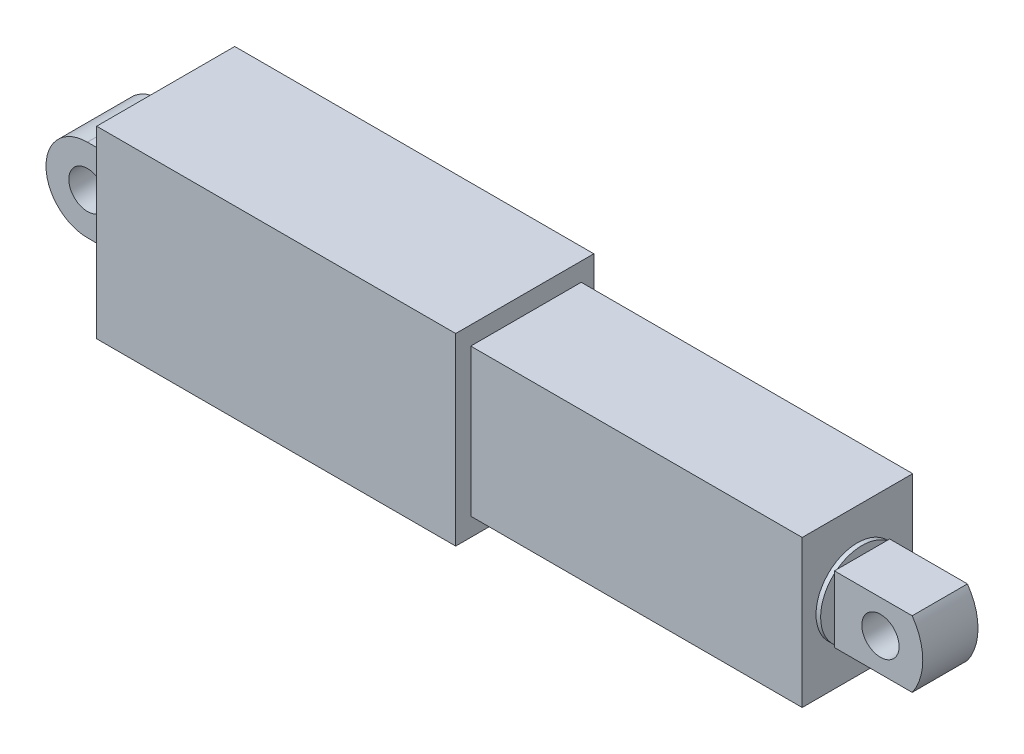
ISO-10303-21;
HEADER;
FILE_DESCRIPTION(('STEP AP214'),'2;1');
FILE_NAME('part.step','',(''),(''),'','','');
FILE_SCHEMA(('AUTOMOTIVE_DESIGN { 1 0 10303 214 1 1 1 1 }'));
ENDSEC;
DATA;
#1=APPLICATION_CONTEXT('core data for automotive mechanical design processes');
#2=APPLICATION_PROTOCOL_DEFINITION('international standard','automotive_design',2000,#1);
#3=PRODUCT_CONTEXT('',#1,'mechanical');
#4=PRODUCT('Part','Part','',(#3));
#5=PRODUCT_RELATED_PRODUCT_CATEGORY('part','',(#4));
#6=PRODUCT_DEFINITION_FORMATION('','',#4);
#7=PRODUCT_DEFINITION_CONTEXT('part definition',#1,'design');
#8=PRODUCT_DEFINITION('design','',#6,#7);
#9=PRODUCT_DEFINITION_SHAPE('','',#8);
#10=(LENGTH_UNIT() NAMED_UNIT(*) SI_UNIT(.MILLI.,.METRE.));
#11=(NAMED_UNIT(*) PLANE_ANGLE_UNIT() SI_UNIT($,.RADIAN.));
#12=(NAMED_UNIT(*) SI_UNIT($,.STERADIAN.) SOLID_ANGLE_UNIT());
#13=UNCERTAINTY_MEASURE_WITH_UNIT(LENGTH_MEASURE(1.E-05),#10,'distance_accuracy_value','');
#14=(GEOMETRIC_REPRESENTATION_CONTEXT(3) GLOBAL_UNCERTAINTY_ASSIGNED_CONTEXT((#13)) GLOBAL_UNIT_ASSIGNED_CONTEXT((#10,
#11,#12)) REPRESENTATION_CONTEXT('',''));
#15=CARTESIAN_POINT('',(0.,0.,0.));
#16=DIRECTION('',(0.,0.,1.));
#17=DIRECTION('',(1.,0.,0.));
#18=AXIS2_PLACEMENT_3D('',#15,#16,#17);
#19=CARTESIAN_POINT('',(56.,0.,7.36600378283812));
#20=DIRECTION('',(1.,0.,0.));
#21=DIRECTION('',(0.,0.,-1.));
#22=AXIS2_PLACEMENT_3D('',#19,#20,#21);
#23=PLANE('',#22);
#24=CARTESIAN_POINT('',(56.,0.,7.36600378283812));
#25=DIRECTION('',(1.,0.,0.));
#26=DIRECTION('',(0.,0.,-1.));
#27=AXIS2_PLACEMENT_3D('',#24,#25,#26);
#28=CIRCLE('',#27,4.5);
#29=CARTESIAN_POINT('',(56.,-3.60478363427384,10.0596138047365));
#30=VERTEX_POINT('',#29);
#31=CARTESIAN_POINT('',(56.,-3.60478363427384,4.67239376093972));
#32=VERTEX_POINT('',#31);
#33=EDGE_CURVE('E514',#30,#32,#28,.T.);
#34=ORIENTED_EDGE('',*,*,#33,.T.);
#35=DIRECTION('',(0.,0.,1.));
#36=VECTOR('',#35,1.);
#37=CARTESIAN_POINT('',(56.,-3.60478363427384,4.36600378283812));
#38=LINE('',#37,#36);
#39=EDGE_CURVE('E11',#32,#30,#38,.T.);
#40=ORIENTED_EDGE('',*,*,#39,.T.);
#41=EDGE_LOOP('',(#34,#40));
#42=FACE_BOUND('',#41,.T.);
#43=ADVANCED_FACE('F45',(#42),#23,.T.);
#44=DIRECTION('',(0.,-1.,0.));
#45=VECTOR('',#44,1.);
#46=CARTESIAN_POINT('',(56.,-3.60478363427384,10.3660037828381));
#47=LINE('',#46,#45);
#48=CARTESIAN_POINT('',(56.,3.35410196624968,10.3660037828381));
#49=VERTEX_POINT('',#48);
#50=CARTESIAN_POINT('',(56.,-3.35410196624968,10.3660037828381));
#51=VERTEX_POINT('',#50);
#52=EDGE_CURVE('E55',#49,#51,#47,.T.);
#53=ORIENTED_EDGE('',*,*,#52,.F.);
#54=EDGE_CURVE('E509',#49,#51,#28,.T.);
#55=ORIENTED_EDGE('',*,*,#54,.T.);
#56=EDGE_LOOP('',(#53,#55));
#57=FACE_BOUND('',#56,.T.);
#58=ADVANCED_FACE('F448',(#57),#23,.T.);
#59=CARTESIAN_POINT('',(56.,-3.35410196624968,4.36600378283812));
#60=VERTEX_POINT('',#59);
#61=CARTESIAN_POINT('',(56.,3.35410196624968,4.36600378283812));
#62=VERTEX_POINT('',#61);
#63=EDGE_CURVE('E253',#60,#62,#28,.T.);
#64=ORIENTED_EDGE('',*,*,#63,.T.);
#65=DIRECTION('',(0.,-1.,0.));
#66=VECTOR('',#65,1.);
#67=CARTESIAN_POINT('',(56.,-3.60478363427384,4.36600378283812));
#68=LINE('',#67,#66);
#69=EDGE_CURVE('E239',#62,#60,#68,.T.);
#70=ORIENTED_EDGE('',*,*,#69,.T.);
#71=EDGE_LOOP('',(#64,#70));
#72=FACE_BOUND('',#71,.T.);
#73=ADVANCED_FACE('F456',(#72),#23,.T.);
#74=CARTESIAN_POINT('',(19.5,10.,15.));
#75=DIRECTION('',(-1.,0.,0.));
#76=DIRECTION('',(0.,-1.,0.));
#77=AXIS2_PLACEMENT_3D('',#74,#75,#76);
#78=PLANE('',#77);
#79=DIRECTION('',(0.,1.,0.));
#80=VECTOR('',#79,1.);
#81=CARTESIAN_POINT('',(19.5,10.,0.));
#82=LINE('',#81,#80);
#83=CARTESIAN_POINT('',(19.5,-10.,0.));
#84=VERTEX_POINT('',#83);
#85=CARTESIAN_POINT('',(19.5,10.,0.));
#86=VERTEX_POINT('',#85);
#87=EDGE_CURVE('E347',#84,#86,#82,.T.);
#88=ORIENTED_EDGE('',*,*,#87,.T.);
#89=DIRECTION('',(0.,0.,-1.));
#90=VECTOR('',#89,1.);
#91=CARTESIAN_POINT('',(19.5,10.,15.));
#92=LINE('',#91,#90);
#93=CARTESIAN_POINT('',(19.5,10.,15.));
#94=VERTEX_POINT('',#93);
#95=EDGE_CURVE('E385',#94,#86,#92,.T.);
#96=ORIENTED_EDGE('',*,*,#95,.F.);
#97=DIRECTION('',(0.,1.,0.));
#98=VECTOR('',#97,1.);
#99=CARTESIAN_POINT('',(19.5,10.,15.));
#100=LINE('',#99,#98);
#101=CARTESIAN_POINT('',(19.5,-10.,15.));
#102=VERTEX_POINT('',#101);
#103=EDGE_CURVE('E348',#102,#94,#100,.T.);
#104=ORIENTED_EDGE('',*,*,#103,.F.);
#105=DIRECTION('',(0.,0.,-1.));
#106=VECTOR('',#105,1.);
#107=CARTESIAN_POINT('',(19.5,-10.,15.));
#108=LINE('',#107,#106);
#109=EDGE_CURVE('E362',#102,#84,#108,.T.);
#110=ORIENTED_EDGE('',*,*,#109,.T.);
#111=EDGE_LOOP('',(#88,#96,#104,#110));
#112=FACE_BOUND('',#111,.T.);
#113=DIRECTION('',(0.,1.,0.));
#114=VECTOR('',#113,1.);
#115=CARTESIAN_POINT('',(19.5,8.,1.36600378283813));
#116=LINE('',#115,#114);
#117=CARTESIAN_POINT('',(19.5,-8.,1.36600378283812));
#118=VERTEX_POINT('',#117);
#119=CARTESIAN_POINT('',(19.5,8.,1.36600378283813));
#120=VERTEX_POINT('',#119);
#121=EDGE_CURVE('E73',#118,#120,#116,.T.);
#122=ORIENTED_EDGE('',*,*,#121,.F.);
#123=DIRECTION('',(0.,0.,-1.));
#124=VECTOR('',#123,1.);
#125=CARTESIAN_POINT('',(19.5,-8.,13.3660037828381));
#126=LINE('',#125,#124);
#127=CARTESIAN_POINT('',(19.5,-8.,13.3660037828381));
#128=VERTEX_POINT('',#127);
#129=EDGE_CURVE('E277',#128,#118,#126,.T.);
#130=ORIENTED_EDGE('',*,*,#129,.F.);
#131=DIRECTION('',(0.,-1.,0.));
#132=VECTOR('',#131,1.);
#133=CARTESIAN_POINT('',(19.5,8.,13.3660037828381));
#134=LINE('',#133,#132);
#135=CARTESIAN_POINT('',(19.5,8.,13.3660037828381));
#136=VERTEX_POINT('',#135);
#137=EDGE_CURVE('E293',#136,#128,#134,.T.);
#138=ORIENTED_EDGE('',*,*,#137,.F.);
#139=DIRECTION('',(0.,0.,1.));
#140=VECTOR('',#139,1.);
#141=CARTESIAN_POINT('',(19.5,8.,13.3660037828381));
#142=LINE('',#141,#140);
#143=EDGE_CURVE('E289',#120,#136,#142,.T.);
#144=ORIENTED_EDGE('',*,*,#143,.F.);
#145=EDGE_LOOP('',(#122,#130,#138,#144));
#146=FACE_BOUND('',#145,.T.);
#147=ADVANCED_FACE('F476',(#112,#146),#78,.F.);
#148=CARTESIAN_POINT('',(-19.5,10.,15.));
#149=DIRECTION('',(1.,0.,0.));
#150=DIRECTION('',(0.,0.,-1.));
#151=AXIS2_PLACEMENT_3D('',#148,#149,#150);
#152=PLANE('',#151);
#153=DIRECTION('',(0.,-1.,0.));
#154=VECTOR('',#153,1.);
#155=CARTESIAN_POINT('',(-19.5,10.,0.));
#156=LINE('',#155,#154);
#157=CARTESIAN_POINT('',(-19.5,10.,0.));
#158=VERTEX_POINT('',#157);
#159=CARTESIAN_POINT('',(-19.5,-10.,0.));
#160=VERTEX_POINT('',#159);
#161=EDGE_CURVE('E369',#158,#160,#156,.T.);
#162=ORIENTED_EDGE('',*,*,#161,.T.);
#163=DIRECTION('',(0.,0.,-1.));
#164=VECTOR('',#163,1.);
#165=CARTESIAN_POINT('',(-19.5,-10.,15.));
#166=LINE('',#165,#164);
#167=CARTESIAN_POINT('',(-19.5,-10.,15.));
#168=VERTEX_POINT('',#167);
#169=EDGE_CURVE('E377',#168,#160,#166,.T.);
#170=ORIENTED_EDGE('',*,*,#169,.F.);
#171=DIRECTION('',(0.,-1.,0.));
#172=VECTOR('',#171,1.);
#173=CARTESIAN_POINT('',(-19.5,10.,15.));
#174=LINE('',#173,#172);
#175=CARTESIAN_POINT('',(-19.5,10.,15.));
#176=VERTEX_POINT('',#175);
#177=EDGE_CURVE('E356',#176,#168,#174,.T.);
#178=ORIENTED_EDGE('',*,*,#177,.F.);
#179=DIRECTION('',(0.,0.,-1.));
#180=VECTOR('',#179,1.);
#181=CARTESIAN_POINT('',(-19.5,10.,15.));
#182=LINE('',#181,#180);
#183=EDGE_CURVE('E381',#176,#158,#182,.T.);
#184=ORIENTED_EDGE('',*,*,#183,.T.);
#185=EDGE_LOOP('',(#162,#170,#178,#184));
#186=FACE_BOUND('',#185,.T.);
#187=DIRECTION('',(0.,1.,0.));
#188=VECTOR('',#187,1.);
#189=CARTESIAN_POINT('',(-19.5,4.5,11.5));
#190=LINE('',#189,#188);
#191=CARTESIAN_POINT('',(-19.5,-4.5,11.5));
#192=VERTEX_POINT('',#191);
#193=CARTESIAN_POINT('',(-19.5,4.5,11.5));
#194=VERTEX_POINT('',#193);
#195=EDGE_CURVE('E319',#192,#194,#190,.T.);
#196=ORIENTED_EDGE('',*,*,#195,.F.);
#197=DIRECTION('',(0.,0.,1.));
#198=VECTOR('',#197,1.);
#199=CARTESIAN_POINT('',(-19.5,-4.5,3.5));
#200=LINE('',#199,#198);
#201=CARTESIAN_POINT('',(-19.5,-4.5,3.5));
#202=VERTEX_POINT('',#201);
#203=EDGE_CURVE('E331',#202,#192,#200,.T.);
#204=ORIENTED_EDGE('',*,*,#203,.F.);
#205=DIRECTION('',(0.,-1.,0.));
#206=VECTOR('',#205,1.);
#207=CARTESIAN_POINT('',(-19.5,4.5,3.5));
#208=LINE('',#207,#206);
#209=CARTESIAN_POINT('',(-19.5,4.5,3.5));
#210=VERTEX_POINT('',#209);
#211=EDGE_CURVE('E327',#210,#202,#208,.T.);
#212=ORIENTED_EDGE('',*,*,#211,.F.);
#213=DIRECTION('',(0.,0.,-1.));
#214=VECTOR('',#213,1.);
#215=CARTESIAN_POINT('',(-19.5,4.5,3.5));
#216=LINE('',#215,#214);
#217=EDGE_CURVE('E323',#194,#210,#216,.T.);
#218=ORIENTED_EDGE('',*,*,#217,.F.);
#219=EDGE_LOOP('',(#196,#204,#212,#218));
#220=FACE_BOUND('',#219,.T.);
#221=ADVANCED_FACE('F434',(#186,#220),#152,.F.);
#222=CARTESIAN_POINT('',(-19.5,10.,15.));
#223=DIRECTION('',(0.,-1.,0.));
#224=DIRECTION('',(0.,0.,-1.));
#225=AXIS2_PLACEMENT_3D('',#222,#223,#224);
#226=PLANE('',#225);
#227=DIRECTION('',(-1.,0.,0.));
#228=VECTOR('',#227,1.);
#229=CARTESIAN_POINT('',(-19.5,10.,0.));
#230=LINE('',#229,#228);
#231=EDGE_CURVE('E366',#86,#158,#230,.T.);
#232=ORIENTED_EDGE('',*,*,#231,.T.);
#233=ORIENTED_EDGE('',*,*,#183,.F.);
#234=DIRECTION('',(-1.,0.,0.));
#235=VECTOR('',#234,1.);
#236=CARTESIAN_POINT('',(-19.5,10.,15.));
#237=LINE('',#236,#235);
#238=EDGE_CURVE('E352',#94,#176,#237,.T.);
#239=ORIENTED_EDGE('',*,*,#238,.F.);
#240=ORIENTED_EDGE('',*,*,#95,.T.);
#241=EDGE_LOOP('',(#232,#233,#239,#240));
#242=FACE_BOUND('',#241,.T.);
#243=ADVANCED_FACE('F696',(#242),#226,.F.);
#244=CARTESIAN_POINT('',(-19.5,-10.,15.));
#245=DIRECTION('',(0.,1.,0.));
#246=DIRECTION('',(0.,0.,1.));
#247=AXIS2_PLACEMENT_3D('',#244,#245,#246);
#248=PLANE('',#247);
#249=DIRECTION('',(1.,0.,0.));
#250=VECTOR('',#249,1.);
#251=CARTESIAN_POINT('',(-19.5,-10.,0.));
#252=LINE('',#251,#250);
#253=EDGE_CURVE('E353',#160,#84,#252,.T.);
#254=ORIENTED_EDGE('',*,*,#253,.T.);
#255=ORIENTED_EDGE('',*,*,#109,.F.);
#256=DIRECTION('',(1.,0.,0.));
#257=VECTOR('',#256,1.);
#258=CARTESIAN_POINT('',(-19.5,-10.,15.));
#259=LINE('',#258,#257);
#260=EDGE_CURVE('E359',#168,#102,#259,.T.);
#261=ORIENTED_EDGE('',*,*,#260,.F.);
#262=ORIENTED_EDGE('',*,*,#169,.T.);
#263=EDGE_LOOP('',(#254,#255,#261,#262));
#264=FACE_BOUND('',#263,.T.);
#265=ADVANCED_FACE('F716',(#264),#248,.F.);
#266=CARTESIAN_POINT('',(0.,0.,15.));
#267=DIRECTION('',(0.,0.,1.));
#268=DIRECTION('',(1.,0.,0.));
#269=AXIS2_PLACEMENT_3D('',#266,#267,#268);
#270=PLANE('',#269);
#271=ORIENTED_EDGE('',*,*,#103,.T.);
#272=ORIENTED_EDGE('',*,*,#238,.T.);
#273=ORIENTED_EDGE('',*,*,#177,.T.);
#274=ORIENTED_EDGE('',*,*,#260,.T.);
#275=EDGE_LOOP('',(#271,#272,#273,#274));
#276=FACE_BOUND('',#275,.T.);
#277=ADVANCED_FACE('F706',(#276),#270,.T.);
#278=CARTESIAN_POINT('',(0.,0.,0.));
#279=DIRECTION('',(0.,0.,1.));
#280=DIRECTION('',(1.,0.,0.));
#281=AXIS2_PLACEMENT_3D('',#278,#279,#280);
#282=PLANE('',#281);
#283=ORIENTED_EDGE('',*,*,#87,.F.);
#284=ORIENTED_EDGE('',*,*,#253,.F.);
#285=ORIENTED_EDGE('',*,*,#161,.F.);
#286=ORIENTED_EDGE('',*,*,#231,.F.);
#287=EDGE_LOOP('',(#283,#284,#285,#286));
#288=FACE_BOUND('',#287,.T.);
#289=ADVANCED_FACE('F676',(#288),#282,.F.);
#290=CARTESIAN_POINT('',(-28.5,4.5,11.5));
#291=DIRECTION('',(0.,0.,-1.));
#292=DIRECTION('',(0.,1.,0.));
#293=AXIS2_PLACEMENT_3D('',#290,#291,#292);
#294=PLANE('',#293);
#295=CARTESIAN_POINT('',(-24.,0.,11.5));
#296=DIRECTION('',(0.,0.,1.));
#297=DIRECTION('',(1.,0.,0.));
#298=AXIS2_PLACEMENT_3D('',#295,#296,#297);
#299=CIRCLE('',#298,2.025);
#300=CARTESIAN_POINT('',(-21.975,0.,11.5));
#301=VERTEX_POINT('',#300);
#302=EDGE_CURVE('E314',#301,#301,#299,.T.);
#303=ORIENTED_EDGE('',*,*,#302,.F.);
#304=EDGE_LOOP('',(#303));
#305=FACE_BOUND('',#304,.T.);
#306=CARTESIAN_POINT('',(-24.,0.,11.5));
#307=DIRECTION('',(0.,0.,-1.));
#308=DIRECTION('',(0.,1.,0.));
#309=AXIS2_PLACEMENT_3D('',#306,#307,#308);
#310=CIRCLE('',#309,4.5);
#311=CARTESIAN_POINT('',(-24.,4.5,11.5));
#312=VERTEX_POINT('',#311);
#313=CARTESIAN_POINT('',(-28.5,0.,11.5));
#314=VERTEX_POINT('',#313);
#315=EDGE_CURVE('E389',#312,#314,#310,.F.);
#316=ORIENTED_EDGE('',*,*,#315,.T.);
#317=CARTESIAN_POINT('',(-24.,0.,11.5));
#318=DIRECTION('',(0.,0.,-1.));
#319=DIRECTION('',(0.,1.,0.));
#320=AXIS2_PLACEMENT_3D('',#317,#318,#319);
#321=CIRCLE('',#320,4.5);
#322=CARTESIAN_POINT('',(-24.,-4.5,11.5));
#323=VERTEX_POINT('',#322);
#324=EDGE_CURVE('E395',#314,#323,#321,.F.);
#325=ORIENTED_EDGE('',*,*,#324,.T.);
#326=DIRECTION('',(1.,0.,0.));
#327=VECTOR('',#326,1.);
#328=CARTESIAN_POINT('',(-28.5,-4.5,11.5));
#329=LINE('',#328,#327);
#330=EDGE_CURVE('E335',#323,#192,#329,.T.);
#331=ORIENTED_EDGE('',*,*,#330,.T.);
#332=ORIENTED_EDGE('',*,*,#195,.T.);
#333=DIRECTION('',(1.,0.,0.));
#334=VECTOR('',#333,1.);
#335=CARTESIAN_POINT('',(-28.5,4.5,11.5));
#336=LINE('',#335,#334);
#337=EDGE_CURVE('E344',#312,#194,#336,.T.);
#338=ORIENTED_EDGE('',*,*,#337,.F.);
#339=EDGE_LOOP('',(#316,#325,#331,#332,#338));
#340=FACE_BOUND('',#339,.T.);
#341=ADVANCED_FACE('F418',(#305,#340),#294,.F.);
#342=CARTESIAN_POINT('',(-28.5,4.5,3.5));
#343=DIRECTION('',(0.,-1.,0.));
#344=DIRECTION('',(0.,0.,-1.));
#345=AXIS2_PLACEMENT_3D('',#342,#343,#344);
#346=PLANE('',#345);
#347=DIRECTION('',(1.,0.,0.));
#348=VECTOR('',#347,1.);
#349=CARTESIAN_POINT('',(-28.5,4.5,3.5));
#350=LINE('',#349,#348);
#351=CARTESIAN_POINT('',(-24.,4.5,3.5));
#352=VERTEX_POINT('',#351);
#353=EDGE_CURVE('E341',#352,#210,#350,.T.);
#354=ORIENTED_EDGE('',*,*,#353,.F.);
#355=DIRECTION('',(0.,0.,-1.));
#356=VECTOR('',#355,1.);
#357=CARTESIAN_POINT('',(-24.,4.5,11.5));
#358=LINE('',#357,#356);
#359=EDGE_CURVE('E271',#352,#312,#358,.F.);
#360=ORIENTED_EDGE('',*,*,#359,.T.);
#361=ORIENTED_EDGE('',*,*,#337,.T.);
#362=ORIENTED_EDGE('',*,*,#217,.T.);
#363=EDGE_LOOP('',(#354,#360,#361,#362));
#364=FACE_BOUND('',#363,.T.);
#365=ADVANCED_FACE('F412',(#364),#346,.F.);
#366=CARTESIAN_POINT('',(-28.5,4.5,3.5));
#367=DIRECTION('',(0.,0.,1.));
#368=DIRECTION('',(0.,-1.,0.));
#369=AXIS2_PLACEMENT_3D('',#366,#367,#368);
#370=PLANE('',#369);
#371=CARTESIAN_POINT('',(-24.,0.,3.5));
#372=DIRECTION('',(0.,0.,1.));
#373=DIRECTION('',(0.,-1.,0.));
#374=AXIS2_PLACEMENT_3D('',#371,#372,#373);
#375=CIRCLE('',#374,2.025);
#376=CARTESIAN_POINT('',(-24.,-2.025,3.5));
#377=VERTEX_POINT('',#376);
#378=EDGE_CURVE('E318',#377,#377,#375,.T.);
#379=ORIENTED_EDGE('',*,*,#378,.T.);
#380=EDGE_LOOP('',(#379));
#381=FACE_BOUND('',#380,.T.);
#382=DIRECTION('',(1.,0.,0.));
#383=VECTOR('',#382,1.);
#384=CARTESIAN_POINT('',(-28.5,-4.5,3.5));
#385=LINE('',#384,#383);
#386=CARTESIAN_POINT('',(-24.,-4.5,3.5));
#387=VERTEX_POINT('',#386);
#388=EDGE_CURVE('E338',#387,#202,#385,.T.);
#389=ORIENTED_EDGE('',*,*,#388,.F.);
#390=CARTESIAN_POINT('',(-24.,0.,3.5));
#391=DIRECTION('',(0.,0.,1.));
#392=DIRECTION('',(0.,-1.,0.));
#393=AXIS2_PLACEMENT_3D('',#390,#391,#392);
#394=CIRCLE('',#393,4.5);
#395=CARTESIAN_POINT('',(-28.5,0.,3.5));
#396=VERTEX_POINT('',#395);
#397=EDGE_CURVE('E405',#387,#396,#394,.F.);
#398=ORIENTED_EDGE('',*,*,#397,.T.);
#399=CARTESIAN_POINT('',(-24.,0.,3.5));
#400=DIRECTION('',(0.,0.,1.));
#401=DIRECTION('',(0.,-1.,0.));
#402=AXIS2_PLACEMENT_3D('',#399,#400,#401);
#403=CIRCLE('',#402,4.5);
#404=EDGE_CURVE('E402',#396,#352,#403,.F.);
#405=ORIENTED_EDGE('',*,*,#404,.T.);
#406=ORIENTED_EDGE('',*,*,#353,.T.);
#407=ORIENTED_EDGE('',*,*,#211,.T.);
#408=EDGE_LOOP('',(#389,#398,#405,#406,#407));
#409=FACE_BOUND('',#408,.T.);
#410=ADVANCED_FACE('F436',(#381,#409),#370,.F.);
#411=CARTESIAN_POINT('',(-28.5,-4.5,3.5));
#412=DIRECTION('',(0.,1.,0.));
#413=DIRECTION('',(0.,0.,1.));
#414=AXIS2_PLACEMENT_3D('',#411,#412,#413);
#415=PLANE('',#414);
#416=ORIENTED_EDGE('',*,*,#330,.F.);
#417=DIRECTION('',(0.,0.,1.));
#418=VECTOR('',#417,1.);
#419=CARTESIAN_POINT('',(-24.,-4.5,3.5));
#420=LINE('',#419,#418);
#421=EDGE_CURVE('E398',#323,#387,#420,.F.);
#422=ORIENTED_EDGE('',*,*,#421,.T.);
#423=ORIENTED_EDGE('',*,*,#388,.T.);
#424=ORIENTED_EDGE('',*,*,#203,.T.);
#425=EDGE_LOOP('',(#416,#422,#423,#424));
#426=FACE_BOUND('',#425,.T.);
#427=ADVANCED_FACE('F429',(#426),#415,.F.);
#428=CARTESIAN_POINT('',(-24.,0.,1.5));
#429=DIRECTION('',(0.,0.,1.));
#430=DIRECTION('',(1.,0.,0.));
#431=AXIS2_PLACEMENT_3D('',#428,#429,#430);
#432=CYLINDRICAL_SURFACE('',#431,2.025);
#433=ORIENTED_EDGE('',*,*,#302,.T.);
#434=EDGE_LOOP('',(#433));
#435=FACE_BOUND('',#434,.T.);
#436=ORIENTED_EDGE('',*,*,#378,.F.);
#437=EDGE_LOOP('',(#436));
#438=FACE_BOUND('',#437,.T.);
#439=ADVANCED_FACE('F444',(#435,#438),#432,.F.);
#440=CARTESIAN_POINT('',(-24.,0.,0.));
#441=DIRECTION('',(0.,0.,1.));
#442=DIRECTION('',(1.,0.,0.));
#443=AXIS2_PLACEMENT_3D('',#440,#441,#442);
#444=CYLINDRICAL_SURFACE('',#443,4.5);
#445=ORIENTED_EDGE('',*,*,#359,.F.);
#446=ORIENTED_EDGE('',*,*,#404,.F.);
#447=DIRECTION('',(0.,0.,-1.));
#448=VECTOR('',#447,1.);
#449=CARTESIAN_POINT('',(-28.5,0.,3.5));
#450=LINE('',#449,#448);
#451=EDGE_CURVE('E49',#314,#396,#450,.T.);
#452=ORIENTED_EDGE('',*,*,#451,.F.);
#453=ORIENTED_EDGE('',*,*,#315,.F.);
#454=EDGE_LOOP('',(#445,#446,#452,#453));
#455=FACE_BOUND('',#454,.T.);
#456=ADVANCED_FACE('F47',(#455),#444,.T.);
#457=CARTESIAN_POINT('',(-24.,0.,0.));
#458=DIRECTION('',(0.,0.,-1.));
#459=DIRECTION('',(-1.,0.,0.));
#460=AXIS2_PLACEMENT_3D('',#457,#458,#459);
#461=CYLINDRICAL_SURFACE('',#460,4.5);
#462=ORIENTED_EDGE('',*,*,#397,.F.);
#463=ORIENTED_EDGE('',*,*,#421,.F.);
#464=ORIENTED_EDGE('',*,*,#324,.F.);
#465=ORIENTED_EDGE('',*,*,#451,.T.);
#466=EDGE_LOOP('',(#462,#463,#464,#465));
#467=FACE_BOUND('',#466,.T.);
#468=ADVANCED_FACE('F426',(#467),#461,.T.);
#469=CARTESIAN_POINT('',(55.5,7.99999999999999,1.36600378283813));
#470=DIRECTION('',(0.,0.,1.));
#471=DIRECTION('',(0.,-1.,0.));
#472=AXIS2_PLACEMENT_3D('',#469,#470,#471);
#473=PLANE('',#472);
#474=ORIENTED_EDGE('',*,*,#121,.T.);
#475=DIRECTION('',(-1.,0.,0.));
#476=VECTOR('',#475,1.);
#477=CARTESIAN_POINT('',(55.5,7.99999999999999,1.36600378283813));
#478=LINE('',#477,#476);
#479=CARTESIAN_POINT('',(55.5,7.99999999999999,1.36600378283813));
#480=VERTEX_POINT('',#479);
#481=EDGE_CURVE('E310',#480,#120,#478,.T.);
#482=ORIENTED_EDGE('',*,*,#481,.F.);
#483=DIRECTION('',(0.,1.,0.));
#484=VECTOR('',#483,1.);
#485=CARTESIAN_POINT('',(55.5,7.99999999999999,1.36600378283813));
#486=LINE('',#485,#484);
#487=CARTESIAN_POINT('',(55.5,-8.00000000000001,1.36600378283812));
#488=VERTEX_POINT('',#487);
#489=EDGE_CURVE('E272',#488,#480,#486,.T.);
#490=ORIENTED_EDGE('',*,*,#489,.F.);
#491=DIRECTION('',(-1.,0.,0.));
#492=VECTOR('',#491,1.);
#493=CARTESIAN_POINT('',(55.5,-8.00000000000001,1.36600378283812));
#494=LINE('',#493,#492);
#495=EDGE_CURVE('E286',#488,#118,#494,.T.);
#496=ORIENTED_EDGE('',*,*,#495,.T.);
#497=EDGE_LOOP('',(#474,#482,#490,#496));
#498=FACE_BOUND('',#497,.T.);
#499=ADVANCED_FACE('F611',(#498),#473,.F.);
#500=CARTESIAN_POINT('',(55.5,7.99999999999999,13.3660037828381));
#501=DIRECTION('',(0.,-1.,0.));
#502=DIRECTION('',(1.,0.,0.));
#503=AXIS2_PLACEMENT_3D('',#500,#501,#502);
#504=PLANE('',#503);
#505=ORIENTED_EDGE('',*,*,#143,.T.);
#506=DIRECTION('',(-1.,0.,0.));
#507=VECTOR('',#506,1.);
#508=CARTESIAN_POINT('',(55.5,7.99999999999999,13.3660037828381));
#509=LINE('',#508,#507);
#510=CARTESIAN_POINT('',(55.5,7.99999999999999,13.3660037828381));
#511=VERTEX_POINT('',#510);
#512=EDGE_CURVE('E306',#511,#136,#509,.T.);
#513=ORIENTED_EDGE('',*,*,#512,.F.);
#514=DIRECTION('',(0.,0.,1.));
#515=VECTOR('',#514,1.);
#516=CARTESIAN_POINT('',(55.5,7.99999999999999,13.3660037828381));
#517=LINE('',#516,#515);
#518=EDGE_CURVE('E276',#480,#511,#517,.T.);
#519=ORIENTED_EDGE('',*,*,#518,.F.);
#520=ORIENTED_EDGE('',*,*,#481,.T.);
#521=EDGE_LOOP('',(#505,#513,#519,#520));
#522=FACE_BOUND('',#521,.T.);
#523=ADVANCED_FACE('F600',(#522),#504,.F.);
#524=CARTESIAN_POINT('',(55.5,7.99999999999999,13.3660037828381));
#525=DIRECTION('',(0.,0.,-1.));
#526=DIRECTION('',(-1.,0.,0.));
#527=AXIS2_PLACEMENT_3D('',#524,#525,#526);
#528=PLANE('',#527);
#529=ORIENTED_EDGE('',*,*,#137,.T.);
#530=DIRECTION('',(-1.,0.,0.));
#531=VECTOR('',#530,1.);
#532=CARTESIAN_POINT('',(55.5,-8.00000000000001,13.3660037828381));
#533=LINE('',#532,#531);
#534=CARTESIAN_POINT('',(55.5,-8.00000000000001,13.3660037828381));
#535=VERTEX_POINT('',#534);
#536=EDGE_CURVE('E302',#535,#128,#533,.T.);
#537=ORIENTED_EDGE('',*,*,#536,.F.);
#538=DIRECTION('',(0.,-1.,0.));
#539=VECTOR('',#538,1.);
#540=CARTESIAN_POINT('',(55.5,7.99999999999999,13.3660037828381));
#541=LINE('',#540,#539);
#542=EDGE_CURVE('E280',#511,#535,#541,.T.);
#543=ORIENTED_EDGE('',*,*,#542,.F.);
#544=ORIENTED_EDGE('',*,*,#512,.T.);
#545=EDGE_LOOP('',(#529,#537,#543,#544));
#546=FACE_BOUND('',#545,.T.);
#547=ADVANCED_FACE('F589',(#546),#528,.F.);
#548=CARTESIAN_POINT('',(55.5,-8.00000000000001,13.3660037828381));
#549=DIRECTION('',(0.,1.,0.));
#550=DIRECTION('',(-1.,0.,0.));
#551=AXIS2_PLACEMENT_3D('',#548,#549,#550);
#552=PLANE('',#551);
#553=ORIENTED_EDGE('',*,*,#129,.T.);
#554=ORIENTED_EDGE('',*,*,#495,.F.);
#555=DIRECTION('',(0.,0.,-1.));
#556=VECTOR('',#555,1.);
#557=CARTESIAN_POINT('',(55.5,-8.00000000000001,13.3660037828381));
#558=LINE('',#557,#556);
#559=EDGE_CURVE('E283',#535,#488,#558,.T.);
#560=ORIENTED_EDGE('',*,*,#559,.F.);
#561=ORIENTED_EDGE('',*,*,#536,.T.);
#562=EDGE_LOOP('',(#553,#554,#560,#561));
#563=FACE_BOUND('',#562,.T.);
#564=ADVANCED_FACE('F581',(#563),#552,.F.);
#565=CARTESIAN_POINT('',(55.5,0.,0.));
#566=DIRECTION('',(1.,0.,0.));
#567=DIRECTION('',(0.,0.,-1.));
#568=AXIS2_PLACEMENT_3D('',#565,#566,#567);
#569=PLANE('',#568);
#570=CARTESIAN_POINT('',(55.5,0.,7.36600378283812));
#571=DIRECTION('',(1.,0.,0.));
#572=DIRECTION('',(0.,0.,-1.));
#573=AXIS2_PLACEMENT_3D('',#570,#571,#572);
#574=CIRCLE('',#573,4.5);
#575=CARTESIAN_POINT('',(55.5,0.,2.86600378283812));
#576=VERTEX_POINT('',#575);
#577=EDGE_CURVE('E267',#576,#576,#574,.T.);
#578=ORIENTED_EDGE('',*,*,#577,.F.);
#579=EDGE_LOOP('',(#578));
#580=FACE_BOUND('',#579,.T.);
#581=ORIENTED_EDGE('',*,*,#489,.T.);
#582=ORIENTED_EDGE('',*,*,#518,.T.);
#583=ORIENTED_EDGE('',*,*,#542,.T.);
#584=ORIENTED_EDGE('',*,*,#559,.T.);
#585=EDGE_LOOP('',(#581,#582,#583,#584));
#586=FACE_BOUND('',#585,.T.);
#587=ADVANCED_FACE('F472',(#580,#586),#569,.T.);
#588=CARTESIAN_POINT('',(56.,0.,7.36600378283812));
#589=DIRECTION('',(-1.,0.,0.));
#590=DIRECTION('',(0.,0.,1.));
#591=AXIS2_PLACEMENT_3D('',#588,#589,#590);
#592=CYLINDRICAL_SURFACE('',#591,4.5);
#593=CARTESIAN_POINT('',(56.,3.60478363427384,4.67239376093972));
#594=VERTEX_POINT('',#593);
#595=EDGE_CURVE('E263',#62,#594,#28,.T.);
#596=ORIENTED_EDGE('',*,*,#595,.F.);
#597=ORIENTED_EDGE('',*,*,#63,.F.);
#598=EDGE_CURVE('E489',#32,#60,#28,.T.);
#599=ORIENTED_EDGE('',*,*,#598,.F.);
#600=ORIENTED_EDGE('',*,*,#33,.F.);
#601=EDGE_CURVE('E211',#51,#30,#28,.T.);
#602=ORIENTED_EDGE('',*,*,#601,.F.);
#603=ORIENTED_EDGE('',*,*,#54,.F.);
#604=CARTESIAN_POINT('',(56.,3.60478363427384,10.0596138047365));
#605=VERTEX_POINT('',#604);
#606=EDGE_CURVE('E506',#605,#49,#28,.T.);
#607=ORIENTED_EDGE('',*,*,#606,.F.);
#608=EDGE_CURVE('E266',#594,#605,#28,.T.);
#609=ORIENTED_EDGE('',*,*,#608,.F.);
#610=EDGE_LOOP('',(#596,#597,#599,#600,#602,#603,#607,#609));
#611=FACE_BOUND('',#610,.T.);
#612=ORIENTED_EDGE('',*,*,#577,.T.);
#613=EDGE_LOOP('',(#612));
#614=FACE_BOUND('',#613,.T.);
#615=ADVANCED_FACE('F463',(#611,#614),#592,.T.);
#616=DIRECTION('',(0.,0.,1.));
#617=VECTOR('',#616,1.);
#618=CARTESIAN_POINT('',(56.,3.60478363427384,4.36600378283812));
#619=LINE('',#618,#617);
#620=EDGE_CURVE('E255',#594,#605,#619,.T.);
#621=ORIENTED_EDGE('',*,*,#620,.F.);
#622=ORIENTED_EDGE('',*,*,#608,.T.);
#623=EDGE_LOOP('',(#621,#622));
#624=FACE_BOUND('',#623,.T.);
#625=ADVANCED_FACE('F451',(#624),#23,.T.);
#626=CARTESIAN_POINT('',(56.,-3.60478363427384,4.36600378283812));
#627=DIRECTION('',(-1.,0.,0.));
#628=DIRECTION('',(0.,0.,1.));
#629=AXIS2_PLACEMENT_3D('',#626,#627,#628);
#630=PLANE('',#629);
#631=CARTESIAN_POINT('',(56.,3.60478363427384,4.36600378283812));
#632=VERTEX_POINT('',#631);
#633=EDGE_CURVE('E234',#632,#62,#68,.T.);
#634=ORIENTED_EDGE('',*,*,#633,.T.);
#635=ORIENTED_EDGE('',*,*,#595,.T.);
#636=EDGE_CURVE('E249',#632,#594,#619,.T.);
#637=ORIENTED_EDGE('',*,*,#636,.F.);
#638=EDGE_LOOP('',(#634,#635,#637));
#639=FACE_BOUND('',#638,.T.);
#640=ADVANCED_FACE('F462',(#639),#630,.T.);
#641=CARTESIAN_POINT('',(56.,3.60478363427384,10.3660037828381));
#642=VERTEX_POINT('',#641);
#643=EDGE_CURVE('E254',#605,#642,#619,.T.);
#644=ORIENTED_EDGE('',*,*,#643,.F.);
#645=ORIENTED_EDGE('',*,*,#606,.T.);
#646=EDGE_CURVE('E206',#642,#49,#47,.T.);
#647=ORIENTED_EDGE('',*,*,#646,.F.);
#648=EDGE_LOOP('',(#644,#645,#647));
#649=FACE_BOUND('',#648,.T.);
#650=ADVANCED_FACE('F469',(#649),#630,.T.);
#651=CARTESIAN_POINT('',(56.,-3.60478363427384,10.3660037828381));
#652=VERTEX_POINT('',#651);
#653=EDGE_CURVE('E193',#51,#652,#47,.T.);
#654=ORIENTED_EDGE('',*,*,#653,.F.);
#655=ORIENTED_EDGE('',*,*,#601,.T.);
#656=EDGE_CURVE('E58',#30,#652,#38,.T.);
#657=ORIENTED_EDGE('',*,*,#656,.T.);
#658=EDGE_LOOP('',(#654,#655,#657));
#659=FACE_BOUND('',#658,.T.);
#660=ADVANCED_FACE('F210',(#659),#630,.T.);
#661=CARTESIAN_POINT('',(56.,-3.60478363427384,4.36600378283812));
#662=VERTEX_POINT('',#661);
#663=EDGE_CURVE('E57',#662,#32,#38,.T.);
#664=ORIENTED_EDGE('',*,*,#663,.T.);
#665=ORIENTED_EDGE('',*,*,#598,.T.);
#666=EDGE_CURVE('E65',#60,#662,#68,.T.);
#667=ORIENTED_EDGE('',*,*,#666,.T.);
#668=EDGE_LOOP('',(#664,#665,#667));
#669=FACE_BOUND('',#668,.T.);
#670=ADVANCED_FACE('F471',(#669),#630,.T.);
#671=CARTESIAN_POINT('',(56.,3.60478363427384,4.36600378283812));
#672=DIRECTION('',(0.,1.,0.));
#673=DIRECTION('',(0.,0.,1.));
#674=AXIS2_PLACEMENT_3D('',#671,#672,#673);
#675=PLANE('',#674);
#676=ORIENTED_EDGE('',*,*,#636,.T.);
#677=ORIENTED_EDGE('',*,*,#620,.T.);
#678=ORIENTED_EDGE('',*,*,#643,.T.);
#679=DIRECTION('',(-1.,0.,0.));
#680=VECTOR('',#679,1.);
#681=CARTESIAN_POINT('',(56.,3.60478363427384,10.3660037828381));
#682=LINE('',#681,#680);
#683=CARTESIAN_POINT('',(64.4455570501838,3.60478363427384,10.3660037828381));
#684=VERTEX_POINT('',#683);
#685=EDGE_CURVE('E223',#684,#642,#682,.T.);
#686=ORIENTED_EDGE('',*,*,#685,.F.);
#687=DIRECTION('',(0.,0.,1.));
#688=VECTOR('',#687,1.);
#689=CARTESIAN_POINT('',(64.4455570501838,3.60478363427384,4.36600378283812));
#690=LINE('',#689,#688);
#691=CARTESIAN_POINT('',(64.4455570501838,3.60478363427384,4.36600378283812));
#692=VERTEX_POINT('',#691);
#693=EDGE_CURVE('E256',#692,#684,#690,.T.);
#694=ORIENTED_EDGE('',*,*,#693,.F.);
#695=DIRECTION('',(-1.,0.,0.));
#696=VECTOR('',#695,1.);
#697=CARTESIAN_POINT('',(56.,3.60478363427384,4.36600378283812));
#698=LINE('',#697,#696);
#699=EDGE_CURVE('E214',#692,#632,#698,.T.);
#700=ORIENTED_EDGE('',*,*,#699,.T.);
#701=EDGE_LOOP('',(#676,#677,#678,#686,#694,#700));
#702=FACE_BOUND('',#701,.T.);
#703=ADVANCED_FACE('F497',(#702),#675,.T.);
#704=CARTESIAN_POINT('',(59.3646253975642,0.,4.36600378283812));
#705=DIRECTION('',(0.,0.,1.));
#706=DIRECTION('',(1.,0.,0.));
#707=AXIS2_PLACEMENT_3D('',#704,#705,#706);
#708=CYLINDRICAL_SURFACE('',#707,6.2297938576264);
#709=ORIENTED_EDGE('',*,*,#693,.T.);
#710=CARTESIAN_POINT('',(59.3646253975642,0.,10.3660037828381));
#711=DIRECTION('',(0.,0.,1.));
#712=DIRECTION('',(-1.,0.,0.));
#713=AXIS2_PLACEMENT_3D('',#710,#711,#712);
#714=CIRCLE('',#713,6.2297938576264);
#715=CARTESIAN_POINT('',(64.4455570501838,-3.60478363427384,10.3660037828381));
#716=VERTEX_POINT('',#715);
#717=EDGE_CURVE('E219',#716,#684,#714,.T.);
#718=ORIENTED_EDGE('',*,*,#717,.F.);
#719=DIRECTION('',(0.,0.,1.));
#720=VECTOR('',#719,1.);
#721=CARTESIAN_POINT('',(64.4455570501838,-3.60478363427384,4.36600378283812));
#722=LINE('',#721,#720);
#723=CARTESIAN_POINT('',(64.4455570501838,-3.60478363427384,4.36600378283812));
#724=VERTEX_POINT('',#723);
#725=EDGE_CURVE('E217',#724,#716,#722,.T.);
#726=ORIENTED_EDGE('',*,*,#725,.F.);
#727=CARTESIAN_POINT('',(59.3646253975642,0.,4.36600378283812));
#728=DIRECTION('',(0.,0.,1.));
#729=DIRECTION('',(-1.,0.,0.));
#730=AXIS2_PLACEMENT_3D('',#727,#728,#729);
#731=CIRCLE('',#730,6.2297938576264);
#732=EDGE_CURVE('E242',#724,#692,#731,.T.);
#733=ORIENTED_EDGE('',*,*,#732,.T.);
#734=EDGE_LOOP('',(#709,#718,#726,#733));
#735=FACE_BOUND('',#734,.T.);
#736=ADVANCED_FACE('F523',(#735),#708,.T.);
#737=CARTESIAN_POINT('',(56.,-3.60478363427384,4.36600378283812));
#738=DIRECTION('',(0.,-1.,0.));
#739=DIRECTION('',(0.,0.,-1.));
#740=AXIS2_PLACEMENT_3D('',#737,#738,#739);
#741=PLANE('',#740);
#742=ORIENTED_EDGE('',*,*,#725,.T.);
#743=DIRECTION('',(1.,0.,0.));
#744=VECTOR('',#743,1.);
#745=CARTESIAN_POINT('',(56.,-3.60478363427384,10.3660037828381));
#746=LINE('',#745,#744);
#747=EDGE_CURVE('E200',#652,#716,#746,.T.);
#748=ORIENTED_EDGE('',*,*,#747,.F.);
#749=ORIENTED_EDGE('',*,*,#656,.F.);
#750=ORIENTED_EDGE('',*,*,#39,.F.);
#751=ORIENTED_EDGE('',*,*,#663,.F.);
#752=DIRECTION('',(1.,0.,0.));
#753=VECTOR('',#752,1.);
#754=CARTESIAN_POINT('',(56.,-3.60478363427384,4.36600378283812));
#755=LINE('',#754,#753);
#756=EDGE_CURVE('E238',#662,#724,#755,.T.);
#757=ORIENTED_EDGE('',*,*,#756,.T.);
#758=EDGE_LOOP('',(#742,#748,#749,#750,#751,#757));
#759=FACE_BOUND('',#758,.T.);
#760=ADVANCED_FACE('F215',(#759),#741,.T.);
#761=CARTESIAN_POINT('',(59.3646253975642,0.,4.36600378283812));
#762=DIRECTION('',(0.,0.,-1.));
#763=DIRECTION('',(-1.,0.,0.));
#764=AXIS2_PLACEMENT_3D('',#761,#762,#763);
#765=PLANE('',#764);
#766=CARTESIAN_POINT('',(61.,0.,4.36600378283812));
#767=DIRECTION('',(0.,0.,1.));
#768=DIRECTION('',(1.,0.,0.));
#769=AXIS2_PLACEMENT_3D('',#766,#767,#768);
#770=CIRCLE('',#769,2.02499999999999);
#771=CARTESIAN_POINT('',(63.025,0.,4.36600378283812));
#772=VERTEX_POINT('',#771);
#773=EDGE_CURVE('E230',#772,#772,#770,.T.);
#774=ORIENTED_EDGE('',*,*,#773,.T.);
#775=EDGE_LOOP('',(#774));
#776=FACE_BOUND('',#775,.T.);
#777=ORIENTED_EDGE('',*,*,#633,.F.);
#778=ORIENTED_EDGE('',*,*,#699,.F.);
#779=ORIENTED_EDGE('',*,*,#732,.F.);
#780=ORIENTED_EDGE('',*,*,#756,.F.);
#781=ORIENTED_EDGE('',*,*,#666,.F.);
#782=ORIENTED_EDGE('',*,*,#69,.F.);
#783=EDGE_LOOP('',(#777,#778,#779,#780,#781,#782));
#784=FACE_BOUND('',#783,.T.);
#785=ADVANCED_FACE('F521',(#776,#784),#765,.T.);
#786=CARTESIAN_POINT('',(61.,0.,4.36600378283812));
#787=DIRECTION('',(0.,0.,1.));
#788=DIRECTION('',(1.,0.,0.));
#789=AXIS2_PLACEMENT_3D('',#786,#787,#788);
#790=CYLINDRICAL_SURFACE('',#789,2.02499999999999);
#791=ORIENTED_EDGE('',*,*,#773,.F.);
#792=EDGE_LOOP('',(#791));
#793=FACE_BOUND('',#792,.T.);
#794=CARTESIAN_POINT('',(61.,0.,10.3660037828381));
#795=DIRECTION('',(0.,0.,1.));
#796=DIRECTION('',(1.,0.,0.));
#797=AXIS2_PLACEMENT_3D('',#794,#795,#796);
#798=CIRCLE('',#797,2.02499999999999);
#799=CARTESIAN_POINT('',(63.025,0.,10.3660037828381));
#800=VERTEX_POINT('',#799);
#801=EDGE_CURVE('E207',#800,#800,#798,.T.);
#802=ORIENTED_EDGE('',*,*,#801,.T.);
#803=EDGE_LOOP('',(#802));
#804=FACE_BOUND('',#803,.T.);
#805=ADVANCED_FACE('F827',(#793,#804),#790,.F.);
#806=CARTESIAN_POINT('',(59.3646253975642,0.,10.3660037828381));
#807=DIRECTION('',(0.,0.,-1.));
#808=DIRECTION('',(-1.,0.,0.));
#809=AXIS2_PLACEMENT_3D('',#806,#807,#808);
#810=PLANE('',#809);
#811=ORIENTED_EDGE('',*,*,#646,.T.);
#812=ORIENTED_EDGE('',*,*,#52,.T.);
#813=ORIENTED_EDGE('',*,*,#653,.T.);
#814=ORIENTED_EDGE('',*,*,#747,.T.);
#815=ORIENTED_EDGE('',*,*,#717,.T.);
#816=ORIENTED_EDGE('',*,*,#685,.T.);
#817=EDGE_LOOP('',(#811,#812,#813,#814,#815,#816));
#818=FACE_BOUND('',#817,.T.);
#819=ORIENTED_EDGE('',*,*,#801,.F.);
#820=EDGE_LOOP('',(#819));
#821=FACE_BOUND('',#820,.T.);
#822=ADVANCED_FACE('F196',(#818,#821),#810,.F.);
#823=CLOSED_SHELL('',(#43,#58,#73,#147,#221,#243,#265,#277,#289,#341,#365,#410,#427,#439,#456,
#468,#499,#523,#547,#564,#587,#615,#625,#640,#650,#660,#670,#703,#736,#760,#785,#805,#822));
#824=MANIFOLD_SOLID_BREP('B2',#823);
#825=ADVANCED_BREP_SHAPE_REPRESENTATION('',(#18,#824),#14);
#826=SHAPE_DEFINITION_REPRESENTATION(#9,#825);
ENDSEC;
END-ISO-10303-21;
